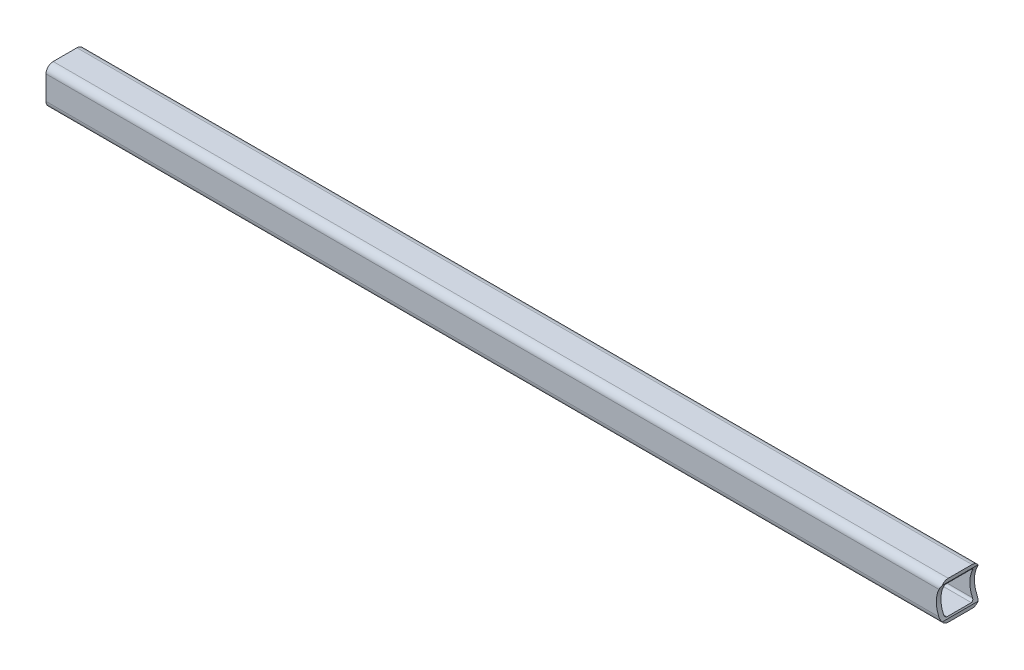
ISO-10303-21;
HEADER;
FILE_DESCRIPTION(('STEP AP214'),'2;1');
FILE_NAME('part.step','',(''),(''),'','','');
FILE_SCHEMA(('AUTOMOTIVE_DESIGN { 1 0 10303 214 1 1 1 1 }'));
ENDSEC;
DATA;
#1=APPLICATION_CONTEXT('core data for automotive mechanical design processes');
#2=APPLICATION_PROTOCOL_DEFINITION('international standard','automotive_design',2000,#1);
#3=PRODUCT_CONTEXT('',#1,'mechanical');
#4=PRODUCT('Part','Part','',(#3));
#5=PRODUCT_RELATED_PRODUCT_CATEGORY('part','',(#4));
#6=PRODUCT_DEFINITION_FORMATION('','',#4);
#7=PRODUCT_DEFINITION_CONTEXT('part definition',#1,'design');
#8=PRODUCT_DEFINITION('design','',#6,#7);
#9=PRODUCT_DEFINITION_SHAPE('','',#8);
#10=(LENGTH_UNIT() NAMED_UNIT(*) SI_UNIT(.MILLI.,.METRE.));
#11=(NAMED_UNIT(*) PLANE_ANGLE_UNIT() SI_UNIT($,.RADIAN.));
#12=(NAMED_UNIT(*) SI_UNIT($,.STERADIAN.) SOLID_ANGLE_UNIT());
#13=UNCERTAINTY_MEASURE_WITH_UNIT(LENGTH_MEASURE(1.E-05),#10,'distance_accuracy_value','');
#14=(GEOMETRIC_REPRESENTATION_CONTEXT(3) GLOBAL_UNCERTAINTY_ASSIGNED_CONTEXT((#13)) GLOBAL_UNIT_ASSIGNED_CONTEXT((#10,
#11,#12)) REPRESENTATION_CONTEXT('',''));
#15=CARTESIAN_POINT('',(0.,0.,0.));
#16=DIRECTION('',(0.,0.,1.));
#17=DIRECTION('',(1.,0.,0.));
#18=AXIS2_PLACEMENT_3D('',#15,#16,#17);
#19=CARTESIAN_POINT('',(596.9,0.,0.));
#20=DIRECTION('',(1.,0.,0.));
#21=DIRECTION('',(0.,0.,-1.));
#22=AXIS2_PLACEMENT_3D('',#19,#20,#21);
#23=PLANE('',#22);
#24=DIRECTION('',(0.,0.,-1.));
#25=VECTOR('',#24,1.);
#26=CARTESIAN_POINT('',(596.9,0.,0.));
#27=LINE('',#26,#25);
#28=CARTESIAN_POINT('',(596.9,0.,-20.6248));
#29=VERTEX_POINT('',#28);
#30=CARTESIAN_POINT('',(596.9,0.,-4.7752));
#31=VERTEX_POINT('',#30);
#32=EDGE_CURVE('E139',#29,#31,#27,.F.);
#33=ORIENTED_EDGE('',*,*,#32,.F.);
#34=CARTESIAN_POINT('',(596.9,4.7752,-20.6248));
#35=DIRECTION('',(-1.,0.,0.));
#36=DIRECTION('',(0.,0.,1.));
#37=AXIS2_PLACEMENT_3D('',#34,#35,#36);
#38=CIRCLE('',#37,4.7752);
#39=CARTESIAN_POINT('',(596.9,2.16971629062194,-24.6265483279394));
#40=VERTEX_POINT('',#39);
#41=EDGE_CURVE('E155',#40,#29,#38,.T.);
#42=ORIENTED_EDGE('',*,*,#41,.F.);
#43=DIRECTION('',(0.,0.,1.));
#44=VECTOR('',#43,1.);
#45=CARTESIAN_POINT('',(596.9,2.1697162906217,0.));
#46=LINE('',#45,#44);
#47=CARTESIAN_POINT('',(596.9,2.16971629062162,-0.773451672060836));
#48=VERTEX_POINT('',#47);
#49=EDGE_CURVE('E142',#40,#48,#46,.T.);
#50=ORIENTED_EDGE('',*,*,#49,.T.);
#51=CARTESIAN_POINT('',(596.9,4.7752,-4.7752));
#52=DIRECTION('',(-1.,0.,0.));
#53=DIRECTION('',(0.,0.,1.));
#54=AXIS2_PLACEMENT_3D('',#51,#52,#53);
#55=CIRCLE('',#54,4.7752);
#56=EDGE_CURVE('E19',#31,#48,#55,.T.);
#57=ORIENTED_EDGE('',*,*,#56,.F.);
#58=EDGE_LOOP('',(#33,#42,#50,#57));
#59=FACE_BOUND('',#58,.T.);
#60=ADVANCED_FACE('F16',(#59),#23,.T.);
#61=CARTESIAN_POINT('',(596.9,0.,0.));
#62=DIRECTION('',(1.,0.,0.));
#63=DIRECTION('',(0.,0.,-1.));
#64=AXIS2_PLACEMENT_3D('',#61,#62,#63);
#65=PLANE('',#64);
#66=DIRECTION('',(0.,0.,1.));
#67=VECTOR('',#66,1.);
#68=CARTESIAN_POINT('',(596.9,25.4,-25.4));
#69=LINE('',#68,#67);
#70=CARTESIAN_POINT('',(596.9,25.4,-4.7752));
#71=VERTEX_POINT('',#70);
#72=CARTESIAN_POINT('',(596.9,25.4,-20.6248));
#73=VERTEX_POINT('',#72);
#74=EDGE_CURVE('E164',#71,#73,#69,.F.);
#75=ORIENTED_EDGE('',*,*,#74,.F.);
#76=CARTESIAN_POINT('',(596.9,20.6248,-4.7752));
#77=DIRECTION('',(-1.,0.,0.));
#78=DIRECTION('',(0.,0.,1.));
#79=AXIS2_PLACEMENT_3D('',#76,#77,#78);
#80=CIRCLE('',#79,4.7752);
#81=CARTESIAN_POINT('',(596.9,23.2302837093779,-0.773451672060514));
#82=VERTEX_POINT('',#81);
#83=EDGE_CURVE('E330',#82,#71,#80,.T.);
#84=ORIENTED_EDGE('',*,*,#83,.F.);
#85=DIRECTION('',(0.,0.,1.));
#86=VECTOR('',#85,1.);
#87=CARTESIAN_POINT('',(596.9,23.230283709378,0.));
#88=LINE('',#87,#86);
#89=CARTESIAN_POINT('',(596.9,23.2302837093777,-24.6265483279396));
#90=VERTEX_POINT('',#89);
#91=EDGE_CURVE('E240',#82,#90,#88,.F.);
#92=ORIENTED_EDGE('',*,*,#91,.T.);
#93=CARTESIAN_POINT('',(596.9,20.6248,-20.6248));
#94=DIRECTION('',(-1.,0.,0.));
#95=DIRECTION('',(0.,0.,1.));
#96=AXIS2_PLACEMENT_3D('',#93,#94,#95);
#97=CIRCLE('',#96,4.7752);
#98=EDGE_CURVE('E337',#73,#90,#97,.T.);
#99=ORIENTED_EDGE('',*,*,#98,.F.);
#100=EDGE_LOOP('',(#75,#84,#92,#99));
#101=FACE_BOUND('',#100,.T.);
#102=ADVANCED_FACE('F266',(#101),#65,.T.);
#103=CARTESIAN_POINT('',(0.,25.4,0.));
#104=DIRECTION('',(0.,0.,1.));
#105=DIRECTION('',(1.,0.,0.));
#106=AXIS2_PLACEMENT_3D('',#103,#104,#105);
#107=PLANE('',#106);
#108=DIRECTION('',(0.,1.,0.));
#109=VECTOR('',#108,1.);
#110=CARTESIAN_POINT('',(0.,0.,0.));
#111=LINE('',#110,#109);
#112=CARTESIAN_POINT('',(0.,20.6248,0.));
#113=VERTEX_POINT('',#112);
#114=CARTESIAN_POINT('',(0.,4.7752,0.));
#115=VERTEX_POINT('',#114);
#116=EDGE_CURVE('E200',#113,#115,#111,.F.);
#117=ORIENTED_EDGE('',*,*,#116,.T.);
#118=DIRECTION('',(-1.,0.,0.));
#119=VECTOR('',#118,1.);
#120=CARTESIAN_POINT('',(1375.01884,4.7752,0.));
#121=LINE('',#120,#119);
#122=CARTESIAN_POINT('',(595.451604115813,4.77520000001665,0.));
#123=VERTEX_POINT('',#122);
#124=EDGE_CURVE('E146',#123,#115,#121,.T.);
#125=ORIENTED_EDGE('',*,*,#124,.F.);
#126=CARTESIAN_POINT('',(612.775,12.7,0.));
#127=DIRECTION('',(0.,0.,1.));
#128=DIRECTION('',(1.,0.,0.));
#129=AXIS2_PLACEMENT_3D('',#126,#127,#128);
#130=CIRCLE('',#129,19.05);
#131=CARTESIAN_POINT('',(595.451604115814,20.6247999999859,0.));
#132=VERTEX_POINT('',#131);
#133=EDGE_CURVE('E241',#123,#132,#130,.F.);
#134=ORIENTED_EDGE('',*,*,#133,.T.);
#135=DIRECTION('',(-1.,0.,0.));
#136=VECTOR('',#135,1.);
#137=CARTESIAN_POINT('',(1375.01884,20.6248,0.));
#138=LINE('',#137,#136);
#139=EDGE_CURVE('E324',#113,#132,#138,.F.);
#140=ORIENTED_EDGE('',*,*,#139,.F.);
#141=EDGE_LOOP('',(#117,#125,#134,#140));
#142=FACE_BOUND('',#141,.T.);
#143=ADVANCED_FACE('F264',(#142),#107,.T.);
#144=CARTESIAN_POINT('',(1375.01884,4.7752,-4.7752));
#145=DIRECTION('',(-1.,0.,0.));
#146=DIRECTION('',(0.,0.,1.));
#147=AXIS2_PLACEMENT_3D('',#144,#145,#146);
#148=CYLINDRICAL_SURFACE('',#147,4.7752);
#149=DIRECTION('',(1.,0.,0.));
#150=VECTOR('',#149,1.);
#151=CARTESIAN_POINT('',(0.,0.,-4.7752));
#152=LINE('',#151,#150);
#153=CARTESIAN_POINT('',(0.,0.,-4.7752));
#154=VERTEX_POINT('',#153);
#155=EDGE_CURVE('E148',#31,#154,#152,.F.);
#156=ORIENTED_EDGE('',*,*,#155,.F.);
#157=ORIENTED_EDGE('',*,*,#56,.T.);
#158=CARTESIAN_POINT('',(596.9,2.16971629062156,-0.773451672060878));
#159=CARTESIAN_POINT('',(596.815784274437,2.29664769168328,-0.690822129177758));
#160=CARTESIAN_POINT('',(596.731282142611,2.42737196654417,-0.614294986894093));
#161=CARTESIAN_POINT('',(596.562570753343,2.69576994890445,-0.473863815448519));
#162=CARTESIAN_POINT('',(596.478361752304,2.83344862039075,-0.409968967644319));
#163=CARTESIAN_POINT('',(596.313056991933,3.11185103980501,-0.296596835299178));
#164=CARTESIAN_POINT('',(596.231933439371,3.2524420797706,-0.246834465171698));
#165=CARTESIAN_POINT('',(596.071740857937,3.53863997016089,-0.160464057992026));
#166=CARTESIAN_POINT('',(595.992670705836,3.6842439725564,-0.12384868256132));
#167=CARTESIAN_POINT('',(595.834735127287,3.98452178973719,-0.0633458660632011));
#168=CARTESIAN_POINT('',(595.755961145082,4.13933647738219,-0.0399143454785772));
#169=CARTESIAN_POINT('',(595.601208026187,4.45410736173006,-0.00815021599517904));
#170=CARTESIAN_POINT('',(595.525271429533,4.61410220517801,5.7195577464761E-06));
#171=CARTESIAN_POINT('',(595.451604115805,4.77520000003329,0.));
#172=B_SPLINE_CURVE_WITH_KNOTS('',3,(#158,#159,#160,#161,#162,#163,#164,#165,#166,#167,#168,
#169,#170,#171),.UNSPECIFIED.,.F.,.F.,(4,2,2,2,2,2,4),(0.,0.519752599826379,1.03988158666225,
1.54862039513931,2.05707479313954,2.58217463046907,3.11331100188989),.UNSPECIFIED.);
#173=EDGE_CURVE('E248',#48,#123,#172,.T.);
#174=ORIENTED_EDGE('',*,*,#173,.T.);
#175=ORIENTED_EDGE('',*,*,#124,.T.);
#176=CARTESIAN_POINT('',(0.,4.7752,-4.7752));
#177=DIRECTION('',(-1.,0.,0.));
#178=DIRECTION('',(0.,0.,1.));
#179=AXIS2_PLACEMENT_3D('',#176,#177,#178);
#180=CIRCLE('',#179,4.7752);
#181=EDGE_CURVE('E152',#115,#154,#180,.F.);
#182=ORIENTED_EDGE('',*,*,#181,.T.);
#183=EDGE_LOOP('',(#156,#157,#174,#175,#182));
#184=FACE_BOUND('',#183,.T.);
#185=ADVANCED_FACE('F149',(#184),#148,.T.);
#186=CARTESIAN_POINT('',(0.,0.,0.));
#187=DIRECTION('',(0.,-1.,0.));
#188=DIRECTION('',(0.,0.,-1.));
#189=AXIS2_PLACEMENT_3D('',#186,#187,#188);
#190=PLANE('',#189);
#191=ORIENTED_EDGE('',*,*,#155,.T.);
#192=DIRECTION('',(0.,0.,-1.));
#193=VECTOR('',#192,1.);
#194=CARTESIAN_POINT('',(0.,0.,0.));
#195=LINE('',#194,#193);
#196=CARTESIAN_POINT('',(0.,0.,-20.6248));
#197=VERTEX_POINT('',#196);
#198=EDGE_CURVE('E305',#154,#197,#195,.T.);
#199=ORIENTED_EDGE('',*,*,#198,.T.);
#200=DIRECTION('',(-1.,0.,0.));
#201=VECTOR('',#200,1.);
#202=CARTESIAN_POINT('',(1375.01884,0.,-20.6248));
#203=LINE('',#202,#201);
#204=EDGE_CURVE('E159',#29,#197,#203,.T.);
#205=ORIENTED_EDGE('',*,*,#204,.F.);
#206=ORIENTED_EDGE('',*,*,#32,.T.);
#207=EDGE_LOOP('',(#191,#199,#205,#206));
#208=FACE_BOUND('',#207,.T.);
#209=ADVANCED_FACE('F157',(#208),#190,.T.);
#210=CARTESIAN_POINT('',(1375.01884,4.7752,-20.6248));
#211=DIRECTION('',(-1.,0.,0.));
#212=DIRECTION('',(0.,0.,1.));
#213=AXIS2_PLACEMENT_3D('',#210,#211,#212);
#214=CYLINDRICAL_SURFACE('',#213,4.7752);
#215=CARTESIAN_POINT('',(0.,4.7752,-20.6248));
#216=DIRECTION('',(-1.,0.,0.));
#217=DIRECTION('',(0.,0.,1.));
#218=AXIS2_PLACEMENT_3D('',#215,#216,#217);
#219=CIRCLE('',#218,4.7752);
#220=CARTESIAN_POINT('',(0.,4.7752,-25.4));
#221=VERTEX_POINT('',#220);
#222=EDGE_CURVE('E304',#197,#221,#219,.F.);
#223=ORIENTED_EDGE('',*,*,#222,.T.);
#224=DIRECTION('',(-1.,0.,0.));
#225=VECTOR('',#224,1.);
#226=CARTESIAN_POINT('',(0.,4.7752,-25.4));
#227=LINE('',#226,#225);
#228=CARTESIAN_POINT('',(595.451604115814,4.77520000001413,-25.4));
#229=VERTEX_POINT('',#228);
#230=EDGE_CURVE('E338',#229,#221,#227,.T.);
#231=ORIENTED_EDGE('',*,*,#230,.F.);
#232=CARTESIAN_POINT('',(595.451604115808,4.77520000002825,-25.4));
#233=CARTESIAN_POINT('',(595.521707070639,4.62190442836433,-25.4000050581122));
#234=CARTESIAN_POINT('',(595.593863233126,4.46960173681768,-25.3926199252558));
#235=CARTESIAN_POINT('',(595.741597669728,4.16807997190467,-25.3636664325664));
#236=CARTESIAN_POINT('',(595.817174971279,4.01886003952048,-25.3421020803229));
#237=CARTESIAN_POINT('',(595.969524727902,3.72754084095972,-25.2859698861279));
#238=CARTESIAN_POINT('',(596.046240630304,3.58535824369313,-25.2516786172088));
#239=CARTESIAN_POINT('',(596.201639362992,3.30575732046714,-25.170617085454));
#240=CARTESIAN_POINT('',(596.28032177868,3.16833800460865,-25.1238494332272));
#241=CARTESIAN_POINT('',(596.448320589756,2.88304937183161,-25.0121077891581));
#242=CARTESIAN_POINT('',(596.537796704269,2.73585904176862,-24.945637079278));
#243=CARTESIAN_POINT('',(596.718288253848,2.44748791135158,-24.7974304464216));
#244=CARTESIAN_POINT('',(596.809309407849,2.30639829200646,-24.7155239762026));
#245=CARTESIAN_POINT('',(596.9,2.16971629062208,-24.6265483279395));
#246=B_SPLINE_CURVE_WITH_KNOTS('',3,(#232,#233,#234,#235,#236,#237,#238,#239,#240,#241,#242,
#243,#244,#245),.UNSPECIFIED.,.F.,.F.,(4,2,2,2,2,2,4),(0.,0.505446361662444,1.01074992622868,
1.50566060293586,2.00046780364538,2.55363208777863,3.11331050978704),.UNSPECIFIED.);
#247=EDGE_CURVE('E254',#229,#40,#246,.T.);
#248=ORIENTED_EDGE('',*,*,#247,.T.);
#249=ORIENTED_EDGE('',*,*,#41,.T.);
#250=ORIENTED_EDGE('',*,*,#204,.T.);
#251=EDGE_LOOP('',(#223,#231,#248,#249,#250));
#252=FACE_BOUND('',#251,.T.);
#253=ADVANCED_FACE('F349',(#252),#214,.T.);
#254=CARTESIAN_POINT('',(0.,0.,-25.4));
#255=DIRECTION('',(0.,0.,-1.));
#256=DIRECTION('',(-1.,0.,0.));
#257=AXIS2_PLACEMENT_3D('',#254,#255,#256);
#258=PLANE('',#257);
#259=DIRECTION('',(0.,1.,0.));
#260=VECTOR('',#259,1.);
#261=CARTESIAN_POINT('',(0.,0.,-25.4));
#262=LINE('',#261,#260);
#263=CARTESIAN_POINT('',(0.,20.6248,-25.4));
#264=VERTEX_POINT('',#263);
#265=EDGE_CURVE('E302',#221,#264,#262,.T.);
#266=ORIENTED_EDGE('',*,*,#265,.T.);
#267=DIRECTION('',(-1.,0.,0.));
#268=VECTOR('',#267,1.);
#269=CARTESIAN_POINT('',(1375.01884,20.6248,-25.4));
#270=LINE('',#269,#268);
#271=CARTESIAN_POINT('',(595.451604115814,20.6247999999859,-25.4));
#272=VERTEX_POINT('',#271);
#273=EDGE_CURVE('E334',#272,#264,#270,.T.);
#274=ORIENTED_EDGE('',*,*,#273,.F.);
#275=CARTESIAN_POINT('',(612.775,12.7,-25.4));
#276=DIRECTION('',(0.,0.,1.));
#277=DIRECTION('',(1.,0.,0.));
#278=AXIS2_PLACEMENT_3D('',#275,#276,#277);
#279=CIRCLE('',#278,19.05);
#280=EDGE_CURVE('E375',#272,#229,#279,.T.);
#281=ORIENTED_EDGE('',*,*,#280,.T.);
#282=ORIENTED_EDGE('',*,*,#230,.T.);
#283=EDGE_LOOP('',(#266,#274,#281,#282));
#284=FACE_BOUND('',#283,.T.);
#285=ADVANCED_FACE('F374',(#284),#258,.T.);
#286=CARTESIAN_POINT('',(1375.01884,20.6248,-20.6248));
#287=DIRECTION('',(-1.,0.,0.));
#288=DIRECTION('',(0.,0.,1.));
#289=AXIS2_PLACEMENT_3D('',#286,#287,#288);
#290=CYLINDRICAL_SURFACE('',#289,4.7752);
#291=DIRECTION('',(1.,0.,0.));
#292=VECTOR('',#291,1.);
#293=CARTESIAN_POINT('',(0.,25.4,-20.6248));
#294=LINE('',#293,#292);
#295=CARTESIAN_POINT('',(0.,25.4,-20.6248));
#296=VERTEX_POINT('',#295);
#297=EDGE_CURVE('E331',#73,#296,#294,.F.);
#298=ORIENTED_EDGE('',*,*,#297,.F.);
#299=ORIENTED_EDGE('',*,*,#98,.T.);
#300=CARTESIAN_POINT('',(596.9,23.2302837093777,-24.6265483279396));
#301=CARTESIAN_POINT('',(596.815784274436,23.103352308316,-24.7091778708227));
#302=CARTESIAN_POINT('',(596.731282142611,22.9726280334551,-24.7857050131063));
#303=CARTESIAN_POINT('',(596.562570753343,22.7042300510948,-24.9261361845518));
#304=CARTESIAN_POINT('',(596.478361752304,22.5665513796085,-24.990031032356));
#305=CARTESIAN_POINT('',(596.313056991933,22.2881489601942,-25.1034031647011));
#306=CARTESIAN_POINT('',(596.231933439371,22.1475579202286,-25.1531655348286));
#307=CARTESIAN_POINT('',(596.071740857936,21.8613600298383,-25.2395359420082));
#308=CARTESIAN_POINT('',(595.992670705835,21.7157560274428,-25.2761513174389));
#309=CARTESIAN_POINT('',(595.834735127287,21.4154782102629,-25.3366541339368));
#310=CARTESIAN_POINT('',(595.755961145083,21.2606635226188,-25.3600856545213));
#311=CARTESIAN_POINT('',(595.601208026188,20.9458926382729,-25.3918497840046));
#312=CARTESIAN_POINT('',(595.525271429535,20.785897794826,-25.4000057195576));
#313=CARTESIAN_POINT('',(595.451604115808,20.6247999999718,-25.4));
#314=B_SPLINE_CURVE_WITH_KNOTS('',3,(#300,#301,#302,#303,#304,#305,#306,#307,#308,#309,#310,
#311,#312,#313),.UNSPECIFIED.,.F.,.F.,(4,2,2,2,2,2,4),(0.,0.519752599826296,1.03988158666219,
1.54862039513925,2.0570747931395,2.58217463046587,3.1133110018833),.UNSPECIFIED.);
#315=EDGE_CURVE('E242',#90,#272,#314,.T.);
#316=ORIENTED_EDGE('',*,*,#315,.T.);
#317=ORIENTED_EDGE('',*,*,#273,.T.);
#318=CARTESIAN_POINT('',(0.,20.6248,-20.6248));
#319=DIRECTION('',(-1.,0.,0.));
#320=DIRECTION('',(0.,0.,1.));
#321=AXIS2_PLACEMENT_3D('',#318,#319,#320);
#322=CIRCLE('',#321,4.7752);
#323=EDGE_CURVE('E301',#264,#296,#322,.F.);
#324=ORIENTED_EDGE('',*,*,#323,.T.);
#325=EDGE_LOOP('',(#298,#299,#316,#317,#324));
#326=FACE_BOUND('',#325,.T.);
#327=ADVANCED_FACE('F368',(#326),#290,.T.);
#328=CARTESIAN_POINT('',(0.,25.4,-25.4));
#329=DIRECTION('',(0.,1.,0.));
#330=DIRECTION('',(0.,0.,1.));
#331=AXIS2_PLACEMENT_3D('',#328,#329,#330);
#332=PLANE('',#331);
#333=ORIENTED_EDGE('',*,*,#297,.T.);
#334=DIRECTION('',(0.,0.,-1.));
#335=VECTOR('',#334,1.);
#336=CARTESIAN_POINT('',(0.,25.4,0.));
#337=LINE('',#336,#335);
#338=CARTESIAN_POINT('',(0.,25.4,-4.7752));
#339=VERTEX_POINT('',#338);
#340=EDGE_CURVE('E299',#296,#339,#337,.F.);
#341=ORIENTED_EDGE('',*,*,#340,.T.);
#342=DIRECTION('',(-1.,0.,0.));
#343=VECTOR('',#342,1.);
#344=CARTESIAN_POINT('',(1375.01884,25.4,-4.7752));
#345=LINE('',#344,#343);
#346=EDGE_CURVE('E327',#71,#339,#345,.T.);
#347=ORIENTED_EDGE('',*,*,#346,.F.);
#348=ORIENTED_EDGE('',*,*,#74,.T.);
#349=EDGE_LOOP('',(#333,#341,#347,#348));
#350=FACE_BOUND('',#349,.T.);
#351=ADVANCED_FACE('F229',(#350),#332,.T.);
#352=CARTESIAN_POINT('',(1375.01884,20.6248,-4.7752));
#353=DIRECTION('',(-1.,0.,0.));
#354=DIRECTION('',(0.,0.,1.));
#355=AXIS2_PLACEMENT_3D('',#352,#353,#354);
#356=CYLINDRICAL_SURFACE('',#355,4.7752);
#357=CARTESIAN_POINT('',(0.,20.6248,-4.7752));
#358=DIRECTION('',(-1.,0.,0.));
#359=DIRECTION('',(0.,0.,1.));
#360=AXIS2_PLACEMENT_3D('',#357,#358,#359);
#361=CIRCLE('',#360,4.7752);
#362=EDGE_CURVE('E298',#339,#113,#361,.F.);
#363=ORIENTED_EDGE('',*,*,#362,.T.);
#364=ORIENTED_EDGE('',*,*,#139,.T.);
#365=CARTESIAN_POINT('',(595.451604115808,20.6247999999717,0.));
#366=CARTESIAN_POINT('',(595.521707070639,20.7780955716357,5.05811216710761E-06));
#367=CARTESIAN_POINT('',(595.593863233126,20.9303982631824,-0.00738007474422727));
#368=CARTESIAN_POINT('',(595.741597669728,21.2319200280954,-0.0363335674336588));
#369=CARTESIAN_POINT('',(595.817174971279,21.3811399604796,-0.0578979196771346));
#370=CARTESIAN_POINT('',(595.969524727902,21.6724591590404,-0.114030113872159));
#371=CARTESIAN_POINT('',(596.046240630304,21.814641756307,-0.148321382791247));
#372=CARTESIAN_POINT('',(596.201639362992,22.094242679533,-0.229382914546027));
#373=CARTESIAN_POINT('',(596.28032177868,22.2316619953914,-0.276150566772792));
#374=CARTESIAN_POINT('',(596.448320589756,22.5169506281684,-0.387892210841958));
#375=CARTESIAN_POINT('',(596.537796704269,22.6641409582314,-0.454362920721986));
#376=CARTESIAN_POINT('',(596.718288253848,22.9525120886485,-0.602569553578462));
#377=CARTESIAN_POINT('',(596.809309407849,23.0936017079936,-0.684476023797436));
#378=CARTESIAN_POINT('',(596.9,23.2302837093779,-0.77345167206054));
#379=B_SPLINE_CURVE_WITH_KNOTS('',3,(#365,#366,#367,#368,#369,#370,#371,#372,#373,#374,#375,
#376,#377,#378),.UNSPECIFIED.,.F.,.F.,(4,2,2,2,2,2,4),(0.,0.505446361662524,1.01074992622881,
1.50566060293604,2.0004678036455,2.55363208777865,3.11331050978704),.UNSPECIFIED.);
#380=EDGE_CURVE('E233',#132,#82,#379,.T.);
#381=ORIENTED_EDGE('',*,*,#380,.T.);
#382=ORIENTED_EDGE('',*,*,#83,.T.);
#383=ORIENTED_EDGE('',*,*,#346,.T.);
#384=EDGE_LOOP('',(#363,#364,#381,#382,#383));
#385=FACE_BOUND('',#384,.T.);
#386=ADVANCED_FACE('F224',(#385),#356,.T.);
#387=CARTESIAN_POINT('',(-778.11884,20.7518,-4.6482));
#388=DIRECTION('',(1.,0.,0.));
#389=DIRECTION('',(0.,0.,-1.));
#390=AXIS2_PLACEMENT_3D('',#387,#388,#389);
#391=CYLINDRICAL_SURFACE('',#390,1.6002);
#392=DIRECTION('',(-1.,0.,0.));
#393=VECTOR('',#392,1.);
#394=CARTESIAN_POINT('',(0.,20.7518,-3.048));
#395=LINE('',#394,#393);
#396=CARTESIAN_POINT('',(0.,20.7518,-3.048));
#397=VERTEX_POINT('',#396);
#398=CARTESIAN_POINT('',(595.510266675669,20.7517999999826,-3.048));
#399=VERTEX_POINT('',#398);
#400=EDGE_CURVE('E313',#397,#399,#395,.F.);
#401=ORIENTED_EDGE('',*,*,#400,.F.);
#402=CARTESIAN_POINT('',(0.,20.7518,-4.6482));
#403=DIRECTION('',(1.,0.,0.));
#404=DIRECTION('',(0.,0.,-1.));
#405=AXIS2_PLACEMENT_3D('',#402,#403,#404);
#406=CIRCLE('',#405,1.6002);
#407=CARTESIAN_POINT('',(0.,22.352,-4.6482));
#408=VERTEX_POINT('',#407);
#409=EDGE_CURVE('E294',#397,#408,#406,.F.);
#410=ORIENTED_EDGE('',*,*,#409,.T.);
#411=DIRECTION('',(1.,0.,0.));
#412=VECTOR('',#411,1.);
#413=CARTESIAN_POINT('',(0.,22.352,-4.6482));
#414=LINE('',#413,#412);
#415=CARTESIAN_POINT('',(596.35119422912,22.3520000000209,-4.6482));
#416=VERTEX_POINT('',#415);
#417=EDGE_CURVE('E321',#416,#408,#414,.F.);
#418=ORIENTED_EDGE('',*,*,#417,.F.);
#419=CARTESIAN_POINT('',(596.351194229111,22.3519999999936,-4.6482));
#420=CARTESIAN_POINT('',(596.351196765112,22.3520026339398,-4.60738232029299));
#421=CARTESIAN_POINT('',(596.350275629837,22.3504370754784,-4.56658637836158));
#422=CARTESIAN_POINT('',(596.346618604768,22.3442109279415,-4.48532885668752));
#423=CARTESIAN_POINT('',(596.343883420597,22.3395515422917,-4.44486715312731));
#424=CARTESIAN_POINT('',(596.333044773922,22.3210614051447,-4.32481723297914));
#425=CARTESIAN_POINT('',(596.322307421339,22.3027176116293,-4.246105522786));
#426=CARTESIAN_POINT('',(596.294500188186,22.25491373993,-4.09350158528763));
#427=CARTESIAN_POINT('',(596.277437386663,22.2254660878606,-4.01960407851427));
#428=CARTESIAN_POINT('',(596.2379192941,22.156692397471,-3.8780603447956));
#429=CARTESIAN_POINT('',(596.215458634533,22.1173565228535,-3.81042043478984));
#430=CARTESIAN_POINT('',(596.164732119597,22.0276098002037,-3.67883665398411));
#431=CARTESIAN_POINT('',(596.136200580814,21.9766796774657,-3.61535137527125));
#432=CARTESIAN_POINT('',(596.07546920359,21.8669029042051,-3.49769302342254));
#433=CARTESIAN_POINT('',(596.043268191832,21.8080537204622,-3.44352294279893));
#434=CARTESIAN_POINT('',(595.971922936261,21.6758251174947,-3.33868506819558));
#435=CARTESIAN_POINT('',(595.932420294563,21.6015513324545,-3.28938835564637));
#436=CARTESIAN_POINT('',(595.851478955973,21.4466905121856,-3.20404147993658));
#437=CARTESIAN_POINT('',(595.810039095827,21.3660996635357,-3.16799939407942));
#438=CARTESIAN_POINT('',(595.725234516406,21.1980604278345,-3.10883467035743));
#439=CARTESIAN_POINT('',(595.681848681816,21.11048163818,-3.08611232775296));
#440=CARTESIAN_POINT('',(595.59548126327,20.9326576953389,-3.05569460011355));
#441=CARTESIAN_POINT('',(595.552499363495,20.8424149021442,-3.04798629728205));
#442=CARTESIAN_POINT('',(595.51026667566,20.7517999999652,-3.048));
#443=B_SPLINE_CURVE_WITH_KNOTS('',3,(#419,#420,#421,#422,#423,#424,#425,#426,#427,#428,#429,
#430,#431,#432,#433,#434,#435,#436,#437,#438,#439,#440,#441,#442),.UNSPECIFIED.,.F.,.F.,(4,2,2,
2,2,2,2,2,2,2,2,4),(0.,0.122370545681125,0.244693519971006,0.4879825093138,0.731000042777371,
0.974260280923537,1.23197825013354,1.48977885733198,1.78109808464064,2.07259454740512,
2.37245345002082,2.67205424553291),.UNSPECIFIED.);
#444=EDGE_CURVE('E205',#416,#399,#443,.T.);
#445=ORIENTED_EDGE('',*,*,#444,.T.);
#446=EDGE_LOOP('',(#401,#410,#418,#445));
#447=FACE_BOUND('',#446,.T.);
#448=ADVANCED_FACE('F218',(#447),#391,.F.);
#449=CARTESIAN_POINT('',(0.,22.352,-3.048));
#450=DIRECTION('',(0.,-1.,0.));
#451=DIRECTION('',(0.,0.,-1.));
#452=AXIS2_PLACEMENT_3D('',#449,#450,#451);
#453=PLANE('',#452);
#454=DIRECTION('',(0.,0.,-1.));
#455=VECTOR('',#454,1.);
#456=CARTESIAN_POINT('',(0.,22.352,0.));
#457=LINE('',#456,#455);
#458=CARTESIAN_POINT('',(0.,22.352,-20.7518));
#459=VERTEX_POINT('',#458);
#460=EDGE_CURVE('E292',#408,#459,#457,.T.);
#461=ORIENTED_EDGE('',*,*,#460,.T.);
#462=DIRECTION('',(1.,0.,0.));
#463=VECTOR('',#462,1.);
#464=CARTESIAN_POINT('',(-778.11884,22.352,-20.7518));
#465=LINE('',#464,#463);
#466=CARTESIAN_POINT('',(596.35119422912,22.3520000000104,-20.7518));
#467=VERTEX_POINT('',#466);
#468=EDGE_CURVE('E319',#459,#467,#465,.T.);
#469=ORIENTED_EDGE('',*,*,#468,.T.);
#470=DIRECTION('',(0.,0.,1.));
#471=VECTOR('',#470,1.);
#472=CARTESIAN_POINT('',(596.351194229132,22.3520000000418,0.));
#473=LINE('',#472,#471);
#474=EDGE_CURVE('E211',#467,#416,#473,.T.);
#475=ORIENTED_EDGE('',*,*,#474,.T.);
#476=ORIENTED_EDGE('',*,*,#417,.T.);
#477=EDGE_LOOP('',(#461,#469,#475,#476));
#478=FACE_BOUND('',#477,.T.);
#479=ADVANCED_FACE('F223',(#478),#453,.T.);
#480=CARTESIAN_POINT('',(-778.11884,20.7518,-20.7518));
#481=DIRECTION('',(1.,0.,0.));
#482=DIRECTION('',(0.,0.,-1.));
#483=AXIS2_PLACEMENT_3D('',#480,#481,#482);
#484=CYLINDRICAL_SURFACE('',#483,1.6002);
#485=ORIENTED_EDGE('',*,*,#468,.F.);
#486=CARTESIAN_POINT('',(0.,20.7518,-20.7518));
#487=DIRECTION('',(1.,0.,0.));
#488=DIRECTION('',(0.,0.,-1.));
#489=AXIS2_PLACEMENT_3D('',#486,#487,#488);
#490=CIRCLE('',#489,1.6002);
#491=CARTESIAN_POINT('',(0.,20.7518,-22.352));
#492=VERTEX_POINT('',#491);
#493=EDGE_CURVE('E291',#459,#492,#490,.F.);
#494=ORIENTED_EDGE('',*,*,#493,.T.);
#495=DIRECTION('',(1.,0.,0.));
#496=VECTOR('',#495,1.);
#497=CARTESIAN_POINT('',(0.,20.7518,-22.352));
#498=LINE('',#497,#496);
#499=CARTESIAN_POINT('',(595.510266675677,20.7518,-22.352));
#500=VERTEX_POINT('',#499);
#501=EDGE_CURVE('E316',#500,#492,#498,.F.);
#502=ORIENTED_EDGE('',*,*,#501,.F.);
#503=CARTESIAN_POINT('',(595.510266675638,20.7517999999757,-22.3519999999753));
#504=CARTESIAN_POINT('',(595.556705145163,20.8514590415594,-22.3520167676864));
#505=CARTESIAN_POINT('',(595.604057148442,20.9506566175463,-22.3426928732836));
#506=CARTESIAN_POINT('',(595.699138898478,21.1456429111266,-22.3059456643067));
#507=CARTESIAN_POINT('',(595.746869098087,21.2414264050255,-22.2784957719542));
#508=CARTESIAN_POINT('',(595.841134983949,21.4268344619328,-22.2060646829726));
#509=CARTESIAN_POINT('',(595.887670089139,21.5164560632245,-22.1610751242386));
#510=CARTESIAN_POINT('',(595.977702270491,21.6867981547707,-22.0543020994975));
#511=CARTESIAN_POINT('',(596.021200518575,21.7675220856698,-21.9925251572626));
#512=CARTESIAN_POINT('',(596.101701966649,21.9146867093301,-21.8554799183588));
#513=CARTESIAN_POINT('',(596.138872364147,21.9815114103022,-21.7807252300197));
#514=CARTESIAN_POINT('',(596.206174048178,22.1011291211382,-21.6178972323359));
#515=CARTESIAN_POINT('',(596.236309667307,22.1539307703259,-21.5298321759701));
#516=CARTESIAN_POINT('',(596.284150539206,22.2371074783461,-21.3541330148471));
#517=CARTESIAN_POINT('',(596.302908350457,22.2694037561437,-21.2676950885854));
#518=CARTESIAN_POINT('',(596.331656470237,22.318720873764,-21.0892912661316));
#519=CARTESIAN_POINT('',(596.341672584274,22.3357866773668,-20.9973425026583));
#520=CARTESIAN_POINT('',(596.348333648041,22.3471308092789,-20.879148477364));
#521=CARTESIAN_POINT('',(596.349406086038,22.3489566392978,-20.8537081371284));
#522=CARTESIAN_POINT('',(596.350835205638,22.3513892857778,-20.8027828760116));
#523=CARTESIAN_POINT('',(596.3511928315,22.351997710421,-20.7772980585127));
#524=CARTESIAN_POINT('',(596.351194229108,22.352,-20.7518000000004));
#525=B_SPLINE_CURVE_WITH_KNOTS('',3,(#503,#504,#505,#506,#507,#508,#509,#510,#511,#512,#513,
#514,#515,#516,#517,#518,#519,#520,#521,#522,#523,#524),.UNSPECIFIED.,.F.,.F.,(4,2,2,2,2,2,2,2,
2,2,4),(0.,0.329409959759443,0.659304002307448,0.989355515851554,1.31927895051689,
1.63829391127842,1.95711187492163,2.23798471664452,2.51802558913313,2.59458480303476,
2.67104281591113),.UNSPECIFIED.);
#526=EDGE_CURVE('E212',#500,#467,#525,.T.);
#527=ORIENTED_EDGE('',*,*,#526,.T.);
#528=EDGE_LOOP('',(#485,#494,#502,#527));
#529=FACE_BOUND('',#528,.T.);
#530=ADVANCED_FACE('F400',(#529),#484,.F.);
#531=CARTESIAN_POINT('',(0.,22.352,-22.352));
#532=DIRECTION('',(0.,0.,1.));
#533=DIRECTION('',(1.,0.,0.));
#534=AXIS2_PLACEMENT_3D('',#531,#532,#533);
#535=PLANE('',#534);
#536=DIRECTION('',(0.,1.,0.));
#537=VECTOR('',#536,1.);
#538=CARTESIAN_POINT('',(0.,0.,-22.352));
#539=LINE('',#538,#537);
#540=CARTESIAN_POINT('',(0.,4.6355,-22.352));
#541=VERTEX_POINT('',#540);
#542=EDGE_CURVE('E288',#492,#541,#539,.F.);
#543=ORIENTED_EDGE('',*,*,#542,.T.);
#544=DIRECTION('',(1.,0.,0.));
#545=VECTOR('',#544,1.);
#546=CARTESIAN_POINT('',(-778.11884,4.6355,-22.352));
#547=LINE('',#546,#545);
#548=CARTESIAN_POINT('',(595.516195297762,4.6355,-22.352));
#549=VERTEX_POINT('',#548);
#550=EDGE_CURVE('E201',#541,#549,#547,.T.);
#551=ORIENTED_EDGE('',*,*,#550,.T.);
#552=CARTESIAN_POINT('',(612.775,12.7,-22.352));
#553=DIRECTION('',(0.,0.,1.));
#554=DIRECTION('',(1.,0.,0.));
#555=AXIS2_PLACEMENT_3D('',#552,#553,#554);
#556=CIRCLE('',#555,19.05);
#557=EDGE_CURVE('E377',#549,#500,#556,.F.);
#558=ORIENTED_EDGE('',*,*,#557,.T.);
#559=ORIENTED_EDGE('',*,*,#501,.T.);
#560=EDGE_LOOP('',(#543,#551,#558,#559));
#561=FACE_BOUND('',#560,.T.);
#562=ADVANCED_FACE('F384',(#561),#535,.T.);
#563=CARTESIAN_POINT('',(0.,3.048,-3.048));
#564=DIRECTION('',(0.,0.,-1.));
#565=DIRECTION('',(-1.,0.,0.));
#566=AXIS2_PLACEMENT_3D('',#563,#564,#565);
#567=PLANE('',#566);
#568=DIRECTION('',(0.,1.,0.));
#569=VECTOR('',#568,1.);
#570=CARTESIAN_POINT('',(0.,0.,-3.048));
#571=LINE('',#570,#569);
#572=CARTESIAN_POINT('',(0.,4.6482,-3.048));
#573=VERTEX_POINT('',#572);
#574=EDGE_CURVE('E295',#573,#397,#571,.T.);
#575=ORIENTED_EDGE('',*,*,#574,.T.);
#576=ORIENTED_EDGE('',*,*,#400,.T.);
#577=CARTESIAN_POINT('',(612.775,12.7,-3.048));
#578=DIRECTION('',(0.,0.,1.));
#579=DIRECTION('',(1.,0.,0.));
#580=AXIS2_PLACEMENT_3D('',#577,#578,#579);
#581=CIRCLE('',#580,19.05);
#582=CARTESIAN_POINT('',(595.510266675669,4.64820000001739,-3.048));
#583=VERTEX_POINT('',#582);
#584=EDGE_CURVE('E203',#399,#583,#581,.T.);
#585=ORIENTED_EDGE('',*,*,#584,.T.);
#586=DIRECTION('',(1.,0.,0.));
#587=VECTOR('',#586,1.);
#588=CARTESIAN_POINT('',(-778.11884,4.6482,-3.048));
#589=LINE('',#588,#587);
#590=EDGE_CURVE('E393',#583,#573,#589,.F.);
#591=ORIENTED_EDGE('',*,*,#590,.T.);
#592=EDGE_LOOP('',(#575,#576,#585,#591));
#593=FACE_BOUND('',#592,.T.);
#594=ADVANCED_FACE('F379',(#593),#567,.T.);
#595=CARTESIAN_POINT('',(612.775,12.7,0.));
#596=DIRECTION('',(0.,0.,1.));
#597=DIRECTION('',(1.,0.,0.));
#598=AXIS2_PLACEMENT_3D('',#595,#596,#597);
#599=CYLINDRICAL_SURFACE('',#598,19.05);
#600=ORIENTED_EDGE('',*,*,#444,.F.);
#601=ORIENTED_EDGE('',*,*,#474,.F.);
#602=ORIENTED_EDGE('',*,*,#526,.F.);
#603=ORIENTED_EDGE('',*,*,#557,.F.);
#604=CARTESIAN_POINT('',(595.516195297752,4.63550000002085,-22.352));
#605=CARTESIAN_POINT('',(595.562361975677,4.53661492878292,-22.35201654567));
#606=CARTESIAN_POINT('',(595.60942857649,4.4381847129852,-22.3427635259864));
#607=CARTESIAN_POINT('',(595.703923682192,4.24469979455938,-22.3062917848114));
#608=CARTESIAN_POINT('',(595.7513526224,4.14965034947203,-22.2790462685157));
#609=CARTESIAN_POINT('',(595.8450104796,3.96565869290105,-22.2071489261522));
#610=CARTESIAN_POINT('',(595.891238799728,3.8767194841779,-22.162488612868));
#611=CARTESIAN_POINT('',(595.980664059204,3.70767575544889,-22.0564908283539));
#612=CARTESIAN_POINT('',(596.023862193244,3.62756774642198,-21.9951599767322));
#613=CARTESIAN_POINT('',(596.103778486919,3.4815628305076,-21.8591264534488));
#614=CARTESIAN_POINT('',(596.140665117215,3.41528007197512,-21.7849399359241));
#615=CARTESIAN_POINT('',(596.207442335732,3.29664000309646,-21.6233511466622));
#616=CARTESIAN_POINT('',(596.237337240894,3.24427409725196,-21.5359570849048));
#617=CARTESIAN_POINT('',(596.28477832423,3.1618089265199,-21.3616267259492));
#618=CARTESIAN_POINT('',(596.303372211303,3.12979857724957,-21.2758795927538));
#619=CARTESIAN_POINT('',(596.331861877338,3.08092877215573,-21.0989079704924));
#620=CARTESIAN_POINT('',(596.341783266107,3.06402470429964,-21.007700464024));
#621=CARTESIAN_POINT('',(596.34837055563,3.05280634952065,-20.890521486194));
#622=CARTESIAN_POINT('',(596.349429162845,3.05100407757636,-20.8653459922441));
#623=CARTESIAN_POINT('',(596.350839840961,3.04860283058019,-20.8149512918882));
#624=CARTESIAN_POINT('',(596.351192844417,3.0480022672999,-20.789732187326));
#625=CARTESIAN_POINT('',(596.351194229108,3.048,-20.7645000000013));
#626=B_SPLINE_CURVE_WITH_KNOTS('',3,(#604,#605,#606,#607,#608,#609,#610,#611,#612,#613,#614,
#615,#616,#617,#618,#619,#620,#621,#622,#623,#624,#625),.UNSPECIFIED.,.F.,.F.,(4,2,2,2,2,2,2,2,
2,2,4),(0.,0.326965567762602,0.654419160906537,0.982032540578588,1.30951601970266,
1.62604061316465,1.94236925405881,2.22096081556229,2.49872689228202,2.57448795170771,
2.65014881583788),.UNSPECIFIED.);
#627=CARTESIAN_POINT('',(596.351194229147,3.048,-20.7645));
#628=VERTEX_POINT('',#627);
#629=EDGE_CURVE('E194',#549,#628,#626,.T.);
#630=ORIENTED_EDGE('',*,*,#629,.T.);
#631=DIRECTION('',(0.,0.,1.));
#632=VECTOR('',#631,1.);
#633=CARTESIAN_POINT('',(596.351194229186,3.048,-22.352));
#634=LINE('',#633,#632);
#635=CARTESIAN_POINT('',(596.351194229147,3.048,-4.6482));
#636=VERTEX_POINT('',#635);
#637=EDGE_CURVE('E174',#636,#628,#634,.F.);
#638=ORIENTED_EDGE('',*,*,#637,.F.);
#639=CARTESIAN_POINT('',(596.351194229119,3.04800000002009,-4.6482));
#640=CARTESIAN_POINT('',(596.351196765115,3.04799736606527,-4.60738232029266));
#641=CARTESIAN_POINT('',(596.350275629838,3.04956292452298,-4.56658637836106));
#642=CARTESIAN_POINT('',(596.346618604768,3.05578907205718,-4.48532885668685));
#643=CARTESIAN_POINT('',(596.343883420597,3.06044845770792,-4.44486715312669));
#644=CARTESIAN_POINT('',(596.333044773923,3.07893859485638,-4.32481723297882));
#645=CARTESIAN_POINT('',(596.322307421339,3.09728238837095,-4.24610552278592));
#646=CARTESIAN_POINT('',(596.294500188186,3.14508626006966,-4.09350158528783));
#647=CARTESIAN_POINT('',(596.277437386663,3.17453391213921,-4.01960407851454));
#648=CARTESIAN_POINT('',(596.2379192941,3.24330760252888,-3.8780603447959));
#649=CARTESIAN_POINT('',(596.215458634533,3.28264347714634,-3.81042043479011));
#650=CARTESIAN_POINT('',(596.164732119597,3.37239019979612,-3.67883665398433));
#651=CARTESIAN_POINT('',(596.136200580814,3.42332032253411,-3.61535137527145));
#652=CARTESIAN_POINT('',(596.07546920359,3.53309709579473,-3.49769302342273));
#653=CARTESIAN_POINT('',(596.043268191832,3.59194627953761,-3.44352294279911));
#654=CARTESIAN_POINT('',(595.971922936261,3.724174882505,-3.33868506819576));
#655=CARTESIAN_POINT('',(595.932420294564,3.79844866754527,-3.28938835564654));
#656=CARTESIAN_POINT('',(595.851478955973,3.95330948781408,-3.20404147993672));
#657=CARTESIAN_POINT('',(595.810039095827,4.03390033646402,-3.16799939407954));
#658=CARTESIAN_POINT('',(595.725234516406,4.20193957216529,-3.1088346703575));
#659=CARTESIAN_POINT('',(595.681848681817,4.28951836181976,-3.08611232775301));
#660=CARTESIAN_POINT('',(595.59548126327,4.46734230466098,-3.05569460011357));
#661=CARTESIAN_POINT('',(595.552499363495,4.55758509785564,-3.04798629728205));
#662=CARTESIAN_POINT('',(595.51026667566,4.64820000003478,-3.048));
#663=B_SPLINE_CURVE_WITH_KNOTS('',3,(#639,#640,#641,#642,#643,#644,#645,#646,#647,#648,#649,
#650,#651,#652,#653,#654,#655,#656,#657,#658,#659,#660,#661,#662),.UNSPECIFIED.,.F.,.F.,(4,2,2,
2,2,2,2,2,2,2,2,4),(0.,0.12237054568143,0.244693519971269,0.487982509313299,0.731000042776657,
0.974260280922864,1.23197825013297,1.48977885733132,1.78109808463989,2.0725945474044,
2.37245345002024,2.67205424553251),.UNSPECIFIED.);
#664=EDGE_CURVE('E166',#636,#583,#663,.T.);
#665=ORIENTED_EDGE('',*,*,#664,.T.);
#666=ORIENTED_EDGE('',*,*,#584,.F.);
#667=EDGE_LOOP('',(#600,#601,#602,#603,#630,#638,#665,#666));
#668=FACE_BOUND('',#667,.T.);
#669=ORIENTED_EDGE('',*,*,#315,.F.);
#670=ORIENTED_EDGE('',*,*,#91,.F.);
#671=ORIENTED_EDGE('',*,*,#380,.F.);
#672=ORIENTED_EDGE('',*,*,#133,.F.);
#673=ORIENTED_EDGE('',*,*,#173,.F.);
#674=ORIENTED_EDGE('',*,*,#49,.F.);
#675=ORIENTED_EDGE('',*,*,#247,.F.);
#676=ORIENTED_EDGE('',*,*,#280,.F.);
#677=EDGE_LOOP('',(#669,#670,#671,#672,#673,#674,#675,#676));
#678=FACE_BOUND('',#677,.T.);
#679=ADVANCED_FACE('F176',(#668,#678),#599,.F.);
#680=CARTESIAN_POINT('',(-778.11884,4.6355,-20.7645));
#681=DIRECTION('',(1.,0.,0.));
#682=DIRECTION('',(0.,0.,-1.));
#683=AXIS2_PLACEMENT_3D('',#680,#681,#682);
#684=CYLINDRICAL_SURFACE('',#683,1.5875);
#685=ORIENTED_EDGE('',*,*,#550,.F.);
#686=CARTESIAN_POINT('',(0.,4.6355,-20.7645));
#687=DIRECTION('',(1.,0.,0.));
#688=DIRECTION('',(0.,0.,-1.));
#689=AXIS2_PLACEMENT_3D('',#686,#687,#688);
#690=CIRCLE('',#689,1.5875);
#691=CARTESIAN_POINT('',(0.,3.048,-20.7645));
#692=VERTEX_POINT('',#691);
#693=EDGE_CURVE('E290',#541,#692,#690,.F.);
#694=ORIENTED_EDGE('',*,*,#693,.T.);
#695=DIRECTION('',(1.,0.,0.));
#696=VECTOR('',#695,1.);
#697=CARTESIAN_POINT('',(0.,3.048,-20.7645));
#698=LINE('',#697,#696);
#699=EDGE_CURVE('E282',#628,#692,#698,.F.);
#700=ORIENTED_EDGE('',*,*,#699,.F.);
#701=ORIENTED_EDGE('',*,*,#629,.F.);
#702=EDGE_LOOP('',(#685,#694,#700,#701));
#703=FACE_BOUND('',#702,.T.);
#704=ADVANCED_FACE('F189',(#703),#684,.F.);
#705=CARTESIAN_POINT('',(0.,0.,0.));
#706=DIRECTION('',(1.,0.,0.));
#707=DIRECTION('',(0.,0.,-1.));
#708=AXIS2_PLACEMENT_3D('',#705,#706,#707);
#709=PLANE('',#708);
#710=ORIENTED_EDGE('',*,*,#693,.F.);
#711=ORIENTED_EDGE('',*,*,#542,.F.);
#712=ORIENTED_EDGE('',*,*,#493,.F.);
#713=ORIENTED_EDGE('',*,*,#460,.F.);
#714=ORIENTED_EDGE('',*,*,#409,.F.);
#715=ORIENTED_EDGE('',*,*,#574,.F.);
#716=CARTESIAN_POINT('',(0.,4.6482,-4.6482));
#717=DIRECTION('',(1.,0.,0.));
#718=DIRECTION('',(0.,0.,-1.));
#719=AXIS2_PLACEMENT_3D('',#716,#717,#718);
#720=CIRCLE('',#719,1.6002);
#721=CARTESIAN_POINT('',(0.,3.048,-4.6482));
#722=VERTEX_POINT('',#721);
#723=EDGE_CURVE('E34',#573,#722,#720,.T.);
#724=ORIENTED_EDGE('',*,*,#723,.T.);
#725=DIRECTION('',(0.,0.,1.));
#726=VECTOR('',#725,1.);
#727=CARTESIAN_POINT('',(0.,3.048,-22.352));
#728=LINE('',#727,#726);
#729=EDGE_CURVE('E25',#692,#722,#728,.T.);
#730=ORIENTED_EDGE('',*,*,#729,.F.);
#731=EDGE_LOOP('',(#710,#711,#712,#713,#714,#715,#724,#730));
#732=FACE_BOUND('',#731,.T.);
#733=ORIENTED_EDGE('',*,*,#340,.F.);
#734=ORIENTED_EDGE('',*,*,#323,.F.);
#735=ORIENTED_EDGE('',*,*,#265,.F.);
#736=ORIENTED_EDGE('',*,*,#222,.F.);
#737=ORIENTED_EDGE('',*,*,#198,.F.);
#738=ORIENTED_EDGE('',*,*,#181,.F.);
#739=ORIENTED_EDGE('',*,*,#116,.F.);
#740=ORIENTED_EDGE('',*,*,#362,.F.);
#741=EDGE_LOOP('',(#733,#734,#735,#736,#737,#738,#739,#740));
#742=FACE_BOUND('',#741,.T.);
#743=ADVANCED_FACE('F186',(#732,#742),#709,.F.);
#744=CARTESIAN_POINT('',(-778.11884,4.6482,-4.6482));
#745=DIRECTION('',(1.,0.,0.));
#746=DIRECTION('',(0.,0.,-1.));
#747=AXIS2_PLACEMENT_3D('',#744,#745,#746);
#748=CYLINDRICAL_SURFACE('',#747,1.6002);
#749=DIRECTION('',(1.,0.,0.));
#750=VECTOR('',#749,1.);
#751=CARTESIAN_POINT('',(0.,3.048,-4.6482));
#752=LINE('',#751,#750);
#753=EDGE_CURVE('E11',#722,#636,#752,.T.);
#754=ORIENTED_EDGE('',*,*,#753,.F.);
#755=ORIENTED_EDGE('',*,*,#723,.F.);
#756=ORIENTED_EDGE('',*,*,#590,.F.);
#757=ORIENTED_EDGE('',*,*,#664,.F.);
#758=EDGE_LOOP('',(#754,#755,#756,#757));
#759=FACE_BOUND('',#758,.T.);
#760=ADVANCED_FACE('F180',(#759),#748,.F.);
#761=CARTESIAN_POINT('',(0.,3.048,-22.352));
#762=DIRECTION('',(0.,1.,0.));
#763=DIRECTION('',(0.,0.,1.));
#764=AXIS2_PLACEMENT_3D('',#761,#762,#763);
#765=PLANE('',#764);
#766=ORIENTED_EDGE('',*,*,#729,.T.);
#767=ORIENTED_EDGE('',*,*,#753,.T.);
#768=ORIENTED_EDGE('',*,*,#637,.T.);
#769=ORIENTED_EDGE('',*,*,#699,.T.);
#770=EDGE_LOOP('',(#766,#767,#768,#769));
#771=FACE_BOUND('',#770,.T.);
#772=ADVANCED_FACE('F185',(#771),#765,.T.);
#773=CLOSED_SHELL('',(#60,#102,#143,#185,#209,#253,#285,#327,#351,#386,#448,#479,#530,#562,#594,
#679,#704,#743,#760,#772));
#774=MANIFOLD_SOLID_BREP('B1',#773);
#775=ADVANCED_BREP_SHAPE_REPRESENTATION('',(#18,#774),#14);
#776=SHAPE_DEFINITION_REPRESENTATION(#9,#775);
ENDSEC;
END-ISO-10303-21;
